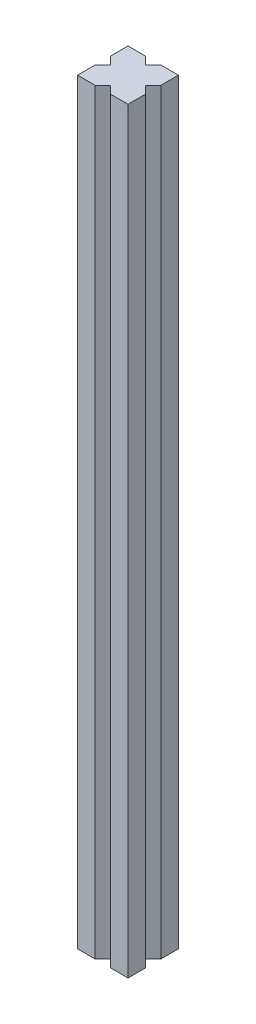
ISO-10303-21;
HEADER;
FILE_DESCRIPTION(('STEP AP214'),'2;1');
FILE_NAME('part.step','',(''),(''),'','','');
FILE_SCHEMA(('AUTOMOTIVE_DESIGN { 1 0 10303 214 1 1 1 1 }'));
ENDSEC;
DATA;
#1=APPLICATION_CONTEXT('core data for automotive mechanical design processes');
#2=APPLICATION_PROTOCOL_DEFINITION('international standard','automotive_design',2000,#1);
#3=PRODUCT_CONTEXT('',#1,'mechanical');
#4=PRODUCT('Part','Part','',(#3));
#5=PRODUCT_RELATED_PRODUCT_CATEGORY('part','',(#4));
#6=PRODUCT_DEFINITION_FORMATION('','',#4);
#7=PRODUCT_DEFINITION_CONTEXT('part definition',#1,'design');
#8=PRODUCT_DEFINITION('design','',#6,#7);
#9=PRODUCT_DEFINITION_SHAPE('','',#8);
#10=(LENGTH_UNIT() NAMED_UNIT(*) SI_UNIT(.MILLI.,.METRE.));
#11=(NAMED_UNIT(*) PLANE_ANGLE_UNIT() SI_UNIT($,.RADIAN.));
#12=(NAMED_UNIT(*) SI_UNIT($,.STERADIAN.) SOLID_ANGLE_UNIT());
#13=UNCERTAINTY_MEASURE_WITH_UNIT(LENGTH_MEASURE(1.E-05),#10,'distance_accuracy_value','');
#14=(GEOMETRIC_REPRESENTATION_CONTEXT(3) GLOBAL_UNCERTAINTY_ASSIGNED_CONTEXT((#13)) GLOBAL_UNIT_ASSIGNED_CONTEXT((#10,
#11,#12)) REPRESENTATION_CONTEXT('',''));
#15=CARTESIAN_POINT('',(0.,0.,0.));
#16=DIRECTION('',(0.,0.,1.));
#17=DIRECTION('',(1.,0.,0.));
#18=AXIS2_PLACEMENT_3D('',#15,#16,#17);
#19=CARTESIAN_POINT('',(0.,300.,0.));
#20=DIRECTION('',(1.,0.,0.));
#21=DIRECTION('',(0.,0.,-1.));
#22=AXIS2_PLACEMENT_3D('',#19,#20,#21);
#23=PLANE('',#22);
#24=DIRECTION('',(0.,0.,1.));
#25=VECTOR('',#24,1.);
#26=CARTESIAN_POINT('',(0.,300.,0.));
#27=LINE('',#26,#25);
#28=CARTESIAN_POINT('',(0.,300.,-7.));
#29=VERTEX_POINT('',#28);
#30=CARTESIAN_POINT('',(0.,300.,0.));
#31=VERTEX_POINT('',#30);
#32=EDGE_CURVE('E181',#29,#31,#27,.T.);
#33=ORIENTED_EDGE('',*,*,#32,.F.);
#34=DIRECTION('',(0.,1.,0.));
#35=VECTOR('',#34,1.);
#36=CARTESIAN_POINT('',(0.,0.,-7.));
#37=LINE('',#36,#35);
#38=CARTESIAN_POINT('',(0.,0.,-7.));
#39=VERTEX_POINT('',#38);
#40=EDGE_CURVE('E231',#39,#29,#37,.T.);
#41=ORIENTED_EDGE('',*,*,#40,.F.);
#42=DIRECTION('',(0.,0.,1.));
#43=VECTOR('',#42,1.);
#44=CARTESIAN_POINT('',(0.,0.,0.));
#45=LINE('',#44,#43);
#46=CARTESIAN_POINT('',(0.,0.,0.));
#47=VERTEX_POINT('',#46);
#48=EDGE_CURVE('E299',#39,#47,#45,.T.);
#49=ORIENTED_EDGE('',*,*,#48,.T.);
#50=DIRECTION('',(0.,-1.,0.));
#51=VECTOR('',#50,1.);
#52=CARTESIAN_POINT('',(0.,300.,0.));
#53=LINE('',#52,#51);
#54=EDGE_CURVE('E11',#31,#47,#53,.T.);
#55=ORIENTED_EDGE('',*,*,#54,.F.);
#56=EDGE_LOOP('',(#33,#41,#49,#55));
#57=FACE_BOUND('',#56,.T.);
#58=ADVANCED_FACE('F34',(#57),#23,.F.);
#59=CARTESIAN_POINT('',(0.,300.,0.));
#60=DIRECTION('',(0.,0.,-1.));
#61=DIRECTION('',(-1.,0.,0.));
#62=AXIS2_PLACEMENT_3D('',#59,#60,#61);
#63=PLANE('',#62);
#64=DIRECTION('',(1.,0.,0.));
#65=VECTOR('',#64,1.);
#66=CARTESIAN_POINT('',(0.,0.,0.));
#67=LINE('',#66,#65);
#68=CARTESIAN_POINT('',(7.,0.,0.));
#69=VERTEX_POINT('',#68);
#70=EDGE_CURVE('E300',#47,#69,#67,.T.);
#71=ORIENTED_EDGE('',*,*,#70,.T.);
#72=DIRECTION('',(0.,1.,0.));
#73=VECTOR('',#72,1.);
#74=CARTESIAN_POINT('',(7.,0.,0.));
#75=LINE('',#74,#73);
#76=CARTESIAN_POINT('',(7.,300.,0.));
#77=VERTEX_POINT('',#76);
#78=EDGE_CURVE('E268',#69,#77,#75,.T.);
#79=ORIENTED_EDGE('',*,*,#78,.T.);
#80=DIRECTION('',(1.,0.,0.));
#81=VECTOR('',#80,1.);
#82=CARTESIAN_POINT('',(0.,300.,0.));
#83=LINE('',#82,#81);
#84=EDGE_CURVE('E288',#31,#77,#83,.T.);
#85=ORIENTED_EDGE('',*,*,#84,.F.);
#86=ORIENTED_EDGE('',*,*,#54,.T.);
#87=EDGE_LOOP('',(#71,#79,#85,#86));
#88=FACE_BOUND('',#87,.T.);
#89=ADVANCED_FACE('F318',(#88),#63,.F.);
#90=CARTESIAN_POINT('',(20.,300.,0.));
#91=DIRECTION('',(-1.,0.,0.));
#92=DIRECTION('',(0.,0.,1.));
#93=AXIS2_PLACEMENT_3D('',#90,#91,#92);
#94=PLANE('',#93);
#95=DIRECTION('',(0.,0.,-1.));
#96=VECTOR('',#95,1.);
#97=CARTESIAN_POINT('',(20.,0.,0.));
#98=LINE('',#97,#96);
#99=CARTESIAN_POINT('',(20.,0.,0.));
#100=VERTEX_POINT('',#99);
#101=CARTESIAN_POINT('',(20.,0.,-7.));
#102=VERTEX_POINT('',#101);
#103=EDGE_CURVE('E174',#100,#102,#98,.T.);
#104=ORIENTED_EDGE('',*,*,#103,.T.);
#105=DIRECTION('',(0.,1.,0.));
#106=VECTOR('',#105,1.);
#107=CARTESIAN_POINT('',(20.,0.,-7.));
#108=LINE('',#107,#106);
#109=CARTESIAN_POINT('',(20.,300.,-7.));
#110=VERTEX_POINT('',#109);
#111=EDGE_CURVE('E234',#102,#110,#108,.T.);
#112=ORIENTED_EDGE('',*,*,#111,.T.);
#113=DIRECTION('',(0.,0.,-1.));
#114=VECTOR('',#113,1.);
#115=CARTESIAN_POINT('',(20.,300.,0.));
#116=LINE('',#115,#114);
#117=CARTESIAN_POINT('',(20.,300.,0.));
#118=VERTEX_POINT('',#117);
#119=EDGE_CURVE('E206',#118,#110,#116,.T.);
#120=ORIENTED_EDGE('',*,*,#119,.F.);
#121=DIRECTION('',(0.,-1.,0.));
#122=VECTOR('',#121,1.);
#123=CARTESIAN_POINT('',(20.,300.,0.));
#124=LINE('',#123,#122);
#125=EDGE_CURVE('E43',#118,#100,#124,.T.);
#126=ORIENTED_EDGE('',*,*,#125,.T.);
#127=EDGE_LOOP('',(#104,#112,#120,#126));
#128=FACE_BOUND('',#127,.T.);
#129=ADVANCED_FACE('F203',(#128),#94,.F.);
#130=CARTESIAN_POINT('',(0.,300.,-20.));
#131=DIRECTION('',(0.,0.,1.));
#132=DIRECTION('',(1.,0.,0.));
#133=AXIS2_PLACEMENT_3D('',#130,#131,#132);
#134=PLANE('',#133);
#135=DIRECTION('',(-1.,0.,0.));
#136=VECTOR('',#135,1.);
#137=CARTESIAN_POINT('',(0.,0.,-20.));
#138=LINE('',#137,#136);
#139=CARTESIAN_POINT('',(20.,0.,-20.));
#140=VERTEX_POINT('',#139);
#141=CARTESIAN_POINT('',(13.,0.,-20.));
#142=VERTEX_POINT('',#141);
#143=EDGE_CURVE('E173',#140,#142,#138,.T.);
#144=ORIENTED_EDGE('',*,*,#143,.T.);
#145=DIRECTION('',(0.,1.,0.));
#146=VECTOR('',#145,1.);
#147=CARTESIAN_POINT('',(13.,0.,-20.));
#148=LINE('',#147,#146);
#149=CARTESIAN_POINT('',(13.,300.,-20.));
#150=VERTEX_POINT('',#149);
#151=EDGE_CURVE('E325',#142,#150,#148,.T.);
#152=ORIENTED_EDGE('',*,*,#151,.T.);
#153=DIRECTION('',(-1.,0.,0.));
#154=VECTOR('',#153,1.);
#155=CARTESIAN_POINT('',(0.,300.,-20.));
#156=LINE('',#155,#154);
#157=CARTESIAN_POINT('',(20.,300.,-20.));
#158=VERTEX_POINT('',#157);
#159=EDGE_CURVE('E191',#158,#150,#156,.T.);
#160=ORIENTED_EDGE('',*,*,#159,.F.);
#161=DIRECTION('',(0.,-1.,0.));
#162=VECTOR('',#161,1.);
#163=CARTESIAN_POINT('',(20.,300.,-20.));
#164=LINE('',#163,#162);
#165=EDGE_CURVE('E190',#158,#140,#164,.T.);
#166=ORIENTED_EDGE('',*,*,#165,.T.);
#167=EDGE_LOOP('',(#144,#152,#160,#166));
#168=FACE_BOUND('',#167,.T.);
#169=ADVANCED_FACE('F343',(#168),#134,.F.);
#170=CARTESIAN_POINT('',(0.,0.,-20.));
#171=VERTEX_POINT('',#170);
#172=CARTESIAN_POINT('',(0.,0.,-13.));
#173=VERTEX_POINT('',#172);
#174=EDGE_CURVE('E171',#171,#173,#45,.T.);
#175=ORIENTED_EDGE('',*,*,#174,.T.);
#176=DIRECTION('',(0.,1.,0.));
#177=VECTOR('',#176,1.);
#178=CARTESIAN_POINT('',(0.,0.,-13.));
#179=LINE('',#178,#177);
#180=CARTESIAN_POINT('',(0.,300.,-13.));
#181=VERTEX_POINT('',#180);
#182=EDGE_CURVE('E255',#173,#181,#179,.T.);
#183=ORIENTED_EDGE('',*,*,#182,.T.);
#184=CARTESIAN_POINT('',(0.,300.,-20.));
#185=VERTEX_POINT('',#184);
#186=EDGE_CURVE('E283',#185,#181,#27,.T.);
#187=ORIENTED_EDGE('',*,*,#186,.F.);
#188=DIRECTION('',(0.,-1.,0.));
#189=VECTOR('',#188,1.);
#190=CARTESIAN_POINT('',(0.,300.,-20.));
#191=LINE('',#190,#189);
#192=EDGE_CURVE('E187',#185,#171,#191,.T.);
#193=ORIENTED_EDGE('',*,*,#192,.T.);
#194=EDGE_LOOP('',(#175,#183,#187,#193));
#195=FACE_BOUND('',#194,.T.);
#196=ADVANCED_FACE('F36',(#195),#23,.F.);
#197=CARTESIAN_POINT('',(13.,300.,0.));
#198=VERTEX_POINT('',#197);
#199=EDGE_CURVE('E287',#198,#118,#83,.T.);
#200=ORIENTED_EDGE('',*,*,#199,.F.);
#201=DIRECTION('',(0.,1.,0.));
#202=VECTOR('',#201,1.);
#203=CARTESIAN_POINT('',(13.,0.,0.));
#204=LINE('',#203,#202);
#205=CARTESIAN_POINT('',(13.,0.,0.));
#206=VERTEX_POINT('',#205);
#207=EDGE_CURVE('E277',#206,#198,#204,.T.);
#208=ORIENTED_EDGE('',*,*,#207,.F.);
#209=EDGE_CURVE('E211',#206,#100,#67,.T.);
#210=ORIENTED_EDGE('',*,*,#209,.T.);
#211=ORIENTED_EDGE('',*,*,#125,.F.);
#212=EDGE_LOOP('',(#200,#208,#210,#211));
#213=FACE_BOUND('',#212,.T.);
#214=ADVANCED_FACE('F307',(#213),#63,.F.);
#215=CARTESIAN_POINT('',(20.,300.,-13.));
#216=VERTEX_POINT('',#215);
#217=EDGE_CURVE('E292',#216,#158,#116,.T.);
#218=ORIENTED_EDGE('',*,*,#217,.F.);
#219=DIRECTION('',(0.,1.,0.));
#220=VECTOR('',#219,1.);
#221=CARTESIAN_POINT('',(20.,0.,-13.));
#222=LINE('',#221,#220);
#223=CARTESIAN_POINT('',(20.,0.,-13.));
#224=VERTEX_POINT('',#223);
#225=EDGE_CURVE('E216',#224,#216,#222,.T.);
#226=ORIENTED_EDGE('',*,*,#225,.F.);
#227=EDGE_CURVE('E183',#224,#140,#98,.T.);
#228=ORIENTED_EDGE('',*,*,#227,.T.);
#229=ORIENTED_EDGE('',*,*,#165,.F.);
#230=EDGE_LOOP('',(#218,#226,#228,#229));
#231=FACE_BOUND('',#230,.T.);
#232=ADVANCED_FACE('F347',(#231),#94,.F.);
#233=CARTESIAN_POINT('',(7.,300.,-20.));
#234=VERTEX_POINT('',#233);
#235=EDGE_CURVE('E164',#234,#185,#156,.T.);
#236=ORIENTED_EDGE('',*,*,#235,.F.);
#237=DIRECTION('',(0.,1.,0.));
#238=VECTOR('',#237,1.);
#239=CARTESIAN_POINT('',(7.,0.,-20.));
#240=LINE('',#239,#238);
#241=CARTESIAN_POINT('',(7.,0.,-20.));
#242=VERTEX_POINT('',#241);
#243=EDGE_CURVE('E151',#242,#234,#240,.T.);
#244=ORIENTED_EDGE('',*,*,#243,.F.);
#245=EDGE_CURVE('E162',#242,#171,#138,.T.);
#246=ORIENTED_EDGE('',*,*,#245,.T.);
#247=ORIENTED_EDGE('',*,*,#192,.F.);
#248=EDGE_LOOP('',(#236,#244,#246,#247));
#249=FACE_BOUND('',#248,.T.);
#250=ADVANCED_FACE('F160',(#249),#134,.F.);
#251=CARTESIAN_POINT('',(0.,300.,0.));
#252=DIRECTION('',(0.,-1.,0.));
#253=DIRECTION('',(0.,0.,-1.));
#254=AXIS2_PLACEMENT_3D('',#251,#252,#253);
#255=PLANE('',#254);
#256=ORIENTED_EDGE('',*,*,#159,.T.);
#257=DIRECTION('',(0.707106781186548,0.,-0.707106781186547));
#258=VECTOR('',#257,1.);
#259=CARTESIAN_POINT('',(13.,300.,-20.));
#260=LINE('',#259,#258);
#261=CARTESIAN_POINT('',(10.,300.,-17.));
#262=VERTEX_POINT('',#261);
#263=EDGE_CURVE('E156',#262,#150,#260,.T.);
#264=ORIENTED_EDGE('',*,*,#263,.F.);
#265=DIRECTION('',(0.707106781186548,0.,0.707106781186547));
#266=VECTOR('',#265,1.);
#267=CARTESIAN_POINT('',(7.,300.,-20.));
#268=LINE('',#267,#266);
#269=EDGE_CURVE('E237',#234,#262,#268,.T.);
#270=ORIENTED_EDGE('',*,*,#269,.F.);
#271=ORIENTED_EDGE('',*,*,#235,.T.);
#272=ORIENTED_EDGE('',*,*,#186,.T.);
#273=DIRECTION('',(-0.707106781186547,0.,-0.707106781186548));
#274=VECTOR('',#273,1.);
#275=CARTESIAN_POINT('',(0.,300.,-13.));
#276=LINE('',#275,#274);
#277=CARTESIAN_POINT('',(3.,300.,-10.));
#278=VERTEX_POINT('',#277);
#279=EDGE_CURVE('E244',#278,#181,#276,.T.);
#280=ORIENTED_EDGE('',*,*,#279,.F.);
#281=DIRECTION('',(0.707106781186548,0.,-0.707106781186548));
#282=VECTOR('',#281,1.);
#283=CARTESIAN_POINT('',(0.,300.,-7.));
#284=LINE('',#283,#282);
#285=EDGE_CURVE('E247',#29,#278,#284,.T.);
#286=ORIENTED_EDGE('',*,*,#285,.F.);
#287=ORIENTED_EDGE('',*,*,#32,.T.);
#288=ORIENTED_EDGE('',*,*,#84,.T.);
#289=DIRECTION('',(-0.707106781186548,0.,0.707106781186547));
#290=VECTOR('',#289,1.);
#291=CARTESIAN_POINT('',(7.,300.,0.));
#292=LINE('',#291,#290);
#293=CARTESIAN_POINT('',(10.,300.,-3.));
#294=VERTEX_POINT('',#293);
#295=EDGE_CURVE('E269',#294,#77,#292,.T.);
#296=ORIENTED_EDGE('',*,*,#295,.F.);
#297=DIRECTION('',(-0.707106781186548,0.,-0.707106781186547));
#298=VECTOR('',#297,1.);
#299=CARTESIAN_POINT('',(13.,300.,0.));
#300=LINE('',#299,#298);
#301=EDGE_CURVE('E265',#198,#294,#300,.T.);
#302=ORIENTED_EDGE('',*,*,#301,.F.);
#303=ORIENTED_EDGE('',*,*,#199,.T.);
#304=ORIENTED_EDGE('',*,*,#119,.T.);
#305=DIRECTION('',(0.707106781186548,0.,0.707106781186548));
#306=VECTOR('',#305,1.);
#307=CARTESIAN_POINT('',(20.,300.,-7.));
#308=LINE('',#307,#306);
#309=CARTESIAN_POINT('',(17.,300.,-10.));
#310=VERTEX_POINT('',#309);
#311=EDGE_CURVE('E224',#310,#110,#308,.T.);
#312=ORIENTED_EDGE('',*,*,#311,.F.);
#313=DIRECTION('',(-0.707106781186547,0.,0.707106781186548));
#314=VECTOR('',#313,1.);
#315=CARTESIAN_POINT('',(20.,300.,-13.));
#316=LINE('',#315,#314);
#317=EDGE_CURVE('E227',#216,#310,#316,.T.);
#318=ORIENTED_EDGE('',*,*,#317,.F.);
#319=ORIENTED_EDGE('',*,*,#217,.T.);
#320=EDGE_LOOP('',(#256,#264,#270,#271,#272,#280,#286,#287,#288,#296,#302,#303,#304,#312,#318,#319));
#321=FACE_BOUND('',#320,.T.);
#322=ADVANCED_FACE('F314',(#321),#255,.F.);
#323=CARTESIAN_POINT('',(0.,0.,0.));
#324=DIRECTION('',(0.,-1.,0.));
#325=DIRECTION('',(0.,0.,-1.));
#326=AXIS2_PLACEMENT_3D('',#323,#324,#325);
#327=PLANE('',#326);
#328=DIRECTION('',(0.707106781186548,0.,-0.707106781186547));
#329=VECTOR('',#328,1.);
#330=CARTESIAN_POINT('',(13.,0.,-20.));
#331=LINE('',#330,#329);
#332=CARTESIAN_POINT('',(10.,0.,-17.));
#333=VERTEX_POINT('',#332);
#334=EDGE_CURVE('E50',#333,#142,#331,.T.);
#335=ORIENTED_EDGE('',*,*,#334,.T.);
#336=ORIENTED_EDGE('',*,*,#143,.F.);
#337=ORIENTED_EDGE('',*,*,#227,.F.);
#338=DIRECTION('',(-0.707106781186547,0.,0.707106781186548));
#339=VECTOR('',#338,1.);
#340=CARTESIAN_POINT('',(20.,0.,-13.));
#341=LINE('',#340,#339);
#342=CARTESIAN_POINT('',(17.,0.,-10.));
#343=VERTEX_POINT('',#342);
#344=EDGE_CURVE('E214',#224,#343,#341,.T.);
#345=ORIENTED_EDGE('',*,*,#344,.T.);
#346=DIRECTION('',(0.707106781186548,0.,0.707106781186548));
#347=VECTOR('',#346,1.);
#348=CARTESIAN_POINT('',(20.,0.,-7.));
#349=LINE('',#348,#347);
#350=EDGE_CURVE('E58',#343,#102,#349,.T.);
#351=ORIENTED_EDGE('',*,*,#350,.T.);
#352=ORIENTED_EDGE('',*,*,#103,.F.);
#353=ORIENTED_EDGE('',*,*,#209,.F.);
#354=DIRECTION('',(-0.707106781186548,0.,-0.707106781186547));
#355=VECTOR('',#354,1.);
#356=CARTESIAN_POINT('',(13.,0.,0.));
#357=LINE('',#356,#355);
#358=CARTESIAN_POINT('',(10.,0.,-3.));
#359=VERTEX_POINT('',#358);
#360=EDGE_CURVE('E264',#206,#359,#357,.T.);
#361=ORIENTED_EDGE('',*,*,#360,.T.);
#362=DIRECTION('',(-0.707106781186548,0.,0.707106781186547));
#363=VECTOR('',#362,1.);
#364=CARTESIAN_POINT('',(7.,0.,0.));
#365=LINE('',#364,#363);
#366=EDGE_CURVE('E261',#359,#69,#365,.T.);
#367=ORIENTED_EDGE('',*,*,#366,.T.);
#368=ORIENTED_EDGE('',*,*,#70,.F.);
#369=ORIENTED_EDGE('',*,*,#48,.F.);
#370=DIRECTION('',(0.707106781186548,0.,-0.707106781186548));
#371=VECTOR('',#370,1.);
#372=CARTESIAN_POINT('',(0.,0.,-7.));
#373=LINE('',#372,#371);
#374=CARTESIAN_POINT('',(3.,0.,-10.));
#375=VERTEX_POINT('',#374);
#376=EDGE_CURVE('E240',#39,#375,#373,.T.);
#377=ORIENTED_EDGE('',*,*,#376,.T.);
#378=DIRECTION('',(-0.707106781186547,0.,-0.707106781186548));
#379=VECTOR('',#378,1.);
#380=CARTESIAN_POINT('',(0.,0.,-13.));
#381=LINE('',#380,#379);
#382=EDGE_CURVE('E243',#375,#173,#381,.T.);
#383=ORIENTED_EDGE('',*,*,#382,.T.);
#384=ORIENTED_EDGE('',*,*,#174,.F.);
#385=ORIENTED_EDGE('',*,*,#245,.F.);
#386=DIRECTION('',(0.707106781186548,0.,0.707106781186547));
#387=VECTOR('',#386,1.);
#388=CARTESIAN_POINT('',(7.,0.,-20.));
#389=LINE('',#388,#387);
#390=EDGE_CURVE('E147',#242,#333,#389,.T.);
#391=ORIENTED_EDGE('',*,*,#390,.T.);
#392=EDGE_LOOP('',(#335,#336,#337,#345,#351,#352,#353,#361,#367,#368,#369,#377,#383,#384,#385,#391));
#393=FACE_BOUND('',#392,.T.);
#394=ADVANCED_FACE('F168',(#393),#327,.T.);
#395=CARTESIAN_POINT('',(7.,0.,0.));
#396=DIRECTION('',(-0.707106781186547,0.,-0.707106781186548));
#397=DIRECTION('',(-0.707106781186548,0.,0.707106781186547));
#398=AXIS2_PLACEMENT_3D('',#395,#396,#397);
#399=PLANE('',#398);
#400=ORIENTED_EDGE('',*,*,#295,.T.);
#401=ORIENTED_EDGE('',*,*,#78,.F.);
#402=ORIENTED_EDGE('',*,*,#366,.F.);
#403=DIRECTION('',(0.,1.,0.));
#404=VECTOR('',#403,1.);
#405=CARTESIAN_POINT('',(10.,0.,-3.));
#406=LINE('',#405,#404);
#407=EDGE_CURVE('E251',#359,#294,#406,.T.);
#408=ORIENTED_EDGE('',*,*,#407,.T.);
#409=EDGE_LOOP('',(#400,#401,#402,#408));
#410=FACE_BOUND('',#409,.T.);
#411=ADVANCED_FACE('F317',(#410),#399,.F.);
#412=CARTESIAN_POINT('',(13.,0.,0.));
#413=DIRECTION('',(0.707106781186547,0.,-0.707106781186548));
#414=DIRECTION('',(-0.707106781186548,0.,-0.707106781186547));
#415=AXIS2_PLACEMENT_3D('',#412,#413,#414);
#416=PLANE('',#415);
#417=ORIENTED_EDGE('',*,*,#301,.T.);
#418=ORIENTED_EDGE('',*,*,#407,.F.);
#419=ORIENTED_EDGE('',*,*,#360,.F.);
#420=ORIENTED_EDGE('',*,*,#207,.T.);
#421=EDGE_LOOP('',(#417,#418,#419,#420));
#422=FACE_BOUND('',#421,.T.);
#423=ADVANCED_FACE('F310',(#422),#416,.F.);
#424=CARTESIAN_POINT('',(0.,0.,-7.));
#425=DIRECTION('',(0.707106781186548,0.,0.707106781186548));
#426=DIRECTION('',(0.707106781186548,0.,-0.707106781186548));
#427=AXIS2_PLACEMENT_3D('',#424,#425,#426);
#428=PLANE('',#427);
#429=ORIENTED_EDGE('',*,*,#285,.T.);
#430=DIRECTION('',(0.,1.,0.));
#431=VECTOR('',#430,1.);
#432=CARTESIAN_POINT('',(3.,0.,-10.));
#433=LINE('',#432,#431);
#434=EDGE_CURVE('E246',#375,#278,#433,.T.);
#435=ORIENTED_EDGE('',*,*,#434,.F.);
#436=ORIENTED_EDGE('',*,*,#376,.F.);
#437=ORIENTED_EDGE('',*,*,#40,.T.);
#438=EDGE_LOOP('',(#429,#435,#436,#437));
#439=FACE_BOUND('',#438,.T.);
#440=ADVANCED_FACE('F363',(#439),#428,.F.);
#441=CARTESIAN_POINT('',(0.,0.,-13.));
#442=DIRECTION('',(0.707106781186548,0.,-0.707106781186547));
#443=DIRECTION('',(-0.707106781186547,0.,-0.707106781186548));
#444=AXIS2_PLACEMENT_3D('',#441,#442,#443);
#445=PLANE('',#444);
#446=ORIENTED_EDGE('',*,*,#279,.T.);
#447=ORIENTED_EDGE('',*,*,#182,.F.);
#448=ORIENTED_EDGE('',*,*,#382,.F.);
#449=ORIENTED_EDGE('',*,*,#434,.T.);
#450=EDGE_LOOP('',(#446,#447,#448,#449));
#451=FACE_BOUND('',#450,.T.);
#452=ADVANCED_FACE('F355',(#451),#445,.F.);
#453=CARTESIAN_POINT('',(20.,0.,-7.));
#454=DIRECTION('',(-0.707106781186548,0.,0.707106781186548));
#455=DIRECTION('',(0.707106781186548,0.,0.707106781186548));
#456=AXIS2_PLACEMENT_3D('',#453,#454,#455);
#457=PLANE('',#456);
#458=ORIENTED_EDGE('',*,*,#311,.T.);
#459=ORIENTED_EDGE('',*,*,#111,.F.);
#460=ORIENTED_EDGE('',*,*,#350,.F.);
#461=DIRECTION('',(0.,1.,0.));
#462=VECTOR('',#461,1.);
#463=CARTESIAN_POINT('',(17.,0.,-10.));
#464=LINE('',#463,#462);
#465=EDGE_CURVE('E221',#343,#310,#464,.T.);
#466=ORIENTED_EDGE('',*,*,#465,.T.);
#467=EDGE_LOOP('',(#458,#459,#460,#466));
#468=FACE_BOUND('',#467,.T.);
#469=ADVANCED_FACE('F353',(#468),#457,.F.);
#470=CARTESIAN_POINT('',(20.,0.,-13.));
#471=DIRECTION('',(-0.707106781186548,0.,-0.707106781186547));
#472=DIRECTION('',(-0.707106781186547,0.,0.707106781186548));
#473=AXIS2_PLACEMENT_3D('',#470,#471,#472);
#474=PLANE('',#473);
#475=ORIENTED_EDGE('',*,*,#317,.T.);
#476=ORIENTED_EDGE('',*,*,#465,.F.);
#477=ORIENTED_EDGE('',*,*,#344,.F.);
#478=ORIENTED_EDGE('',*,*,#225,.T.);
#479=EDGE_LOOP('',(#475,#476,#477,#478));
#480=FACE_BOUND('',#479,.T.);
#481=ADVANCED_FACE('F351',(#480),#474,.F.);
#482=CARTESIAN_POINT('',(13.,0.,-20.));
#483=DIRECTION('',(0.707106781186547,0.,0.707106781186548));
#484=DIRECTION('',(0.707106781186548,0.,-0.707106781186547));
#485=AXIS2_PLACEMENT_3D('',#482,#483,#484);
#486=PLANE('',#485);
#487=ORIENTED_EDGE('',*,*,#263,.T.);
#488=ORIENTED_EDGE('',*,*,#151,.F.);
#489=ORIENTED_EDGE('',*,*,#334,.F.);
#490=DIRECTION('',(0.,1.,0.));
#491=VECTOR('',#490,1.);
#492=CARTESIAN_POINT('',(10.,0.,-17.));
#493=LINE('',#492,#491);
#494=EDGE_CURVE('E153',#333,#262,#493,.T.);
#495=ORIENTED_EDGE('',*,*,#494,.T.);
#496=EDGE_LOOP('',(#487,#488,#489,#495));
#497=FACE_BOUND('',#496,.T.);
#498=ADVANCED_FACE('F361',(#497),#486,.F.);
#499=CARTESIAN_POINT('',(7.,0.,-20.));
#500=DIRECTION('',(-0.707106781186547,0.,0.707106781186548));
#501=DIRECTION('',(0.707106781186548,0.,0.707106781186547));
#502=AXIS2_PLACEMENT_3D('',#499,#500,#501);
#503=PLANE('',#502);
#504=ORIENTED_EDGE('',*,*,#269,.T.);
#505=ORIENTED_EDGE('',*,*,#494,.F.);
#506=ORIENTED_EDGE('',*,*,#390,.F.);
#507=ORIENTED_EDGE('',*,*,#243,.T.);
#508=EDGE_LOOP('',(#504,#505,#506,#507));
#509=FACE_BOUND('',#508,.T.);
#510=ADVANCED_FACE('F150',(#509),#503,.F.);
#511=CLOSED_SHELL('',(#58,#89,#129,#169,#196,#214,#232,#250,#322,#394,#411,#423,#440,#452,#469,
#481,#498,#510));
#512=MANIFOLD_SOLID_BREP('B2',#511);
#513=ADVANCED_BREP_SHAPE_REPRESENTATION('',(#18,#512),#14);
#514=SHAPE_DEFINITION_REPRESENTATION(#9,#513);
ENDSEC;
END-ISO-10303-21;
